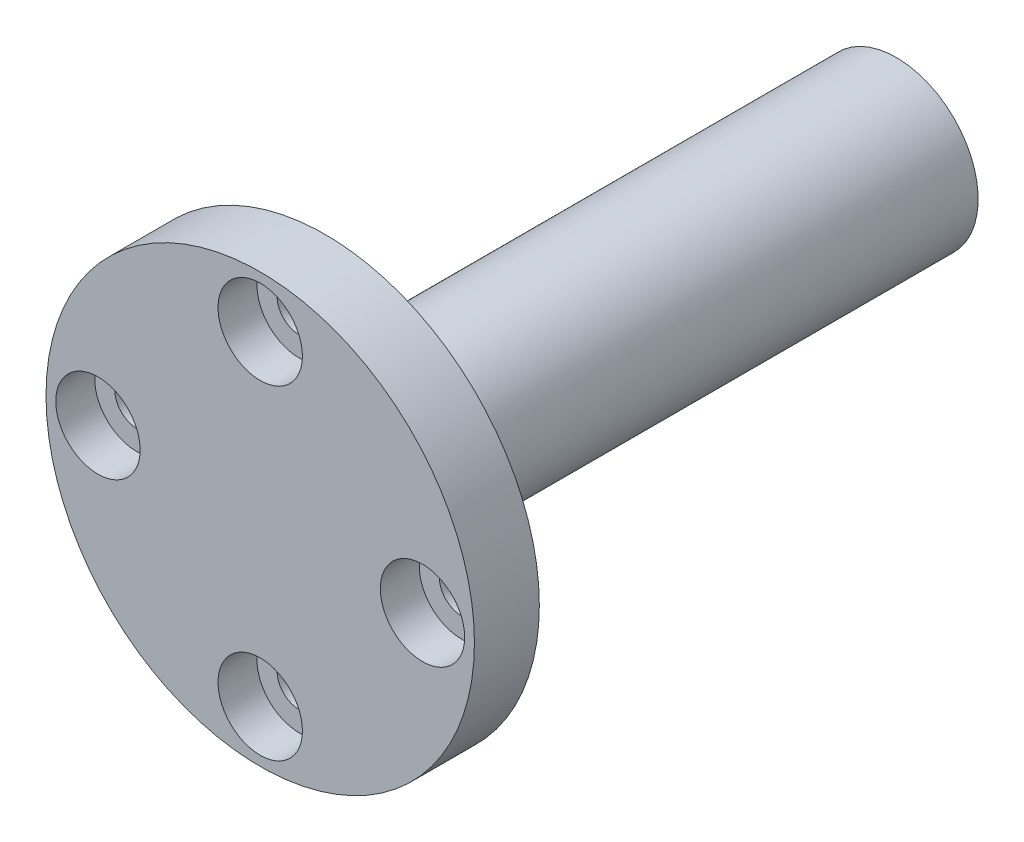
ISO-10303-21;
HEADER;
FILE_DESCRIPTION(('STEP AP214'),'2;1');
FILE_NAME('part.step','',(''),(''),'','','');
FILE_SCHEMA(('AUTOMOTIVE_DESIGN { 1 0 10303 214 1 1 1 1 }'));
ENDSEC;
DATA;
#1=APPLICATION_CONTEXT('core data for automotive mechanical design processes');
#2=APPLICATION_PROTOCOL_DEFINITION('international standard','automotive_design',2000,#1);
#3=PRODUCT_CONTEXT('',#1,'mechanical');
#4=PRODUCT('Part','Part','',(#3));
#5=PRODUCT_RELATED_PRODUCT_CATEGORY('part','',(#4));
#6=PRODUCT_DEFINITION_FORMATION('','',#4);
#7=PRODUCT_DEFINITION_CONTEXT('part definition',#1,'design');
#8=PRODUCT_DEFINITION('design','',#6,#7);
#9=PRODUCT_DEFINITION_SHAPE('','',#8);
#10=(LENGTH_UNIT() NAMED_UNIT(*) SI_UNIT(.MILLI.,.METRE.));
#11=(NAMED_UNIT(*) PLANE_ANGLE_UNIT() SI_UNIT($,.RADIAN.));
#12=(NAMED_UNIT(*) SI_UNIT($,.STERADIAN.) SOLID_ANGLE_UNIT());
#13=UNCERTAINTY_MEASURE_WITH_UNIT(LENGTH_MEASURE(1.E-05),#10,'distance_accuracy_value','');
#14=(GEOMETRIC_REPRESENTATION_CONTEXT(3) GLOBAL_UNCERTAINTY_ASSIGNED_CONTEXT((#13)) GLOBAL_UNIT_ASSIGNED_CONTEXT((#10,
#11,#12)) REPRESENTATION_CONTEXT('',''));
#15=CARTESIAN_POINT('',(0.,0.,0.));
#16=DIRECTION('',(0.,0.,1.));
#17=DIRECTION('',(1.,0.,0.));
#18=AXIS2_PLACEMENT_3D('',#15,#16,#17);
#19=CARTESIAN_POINT('',(0.,0.,0.));
#20=DIRECTION('',(0.,0.,1.));
#21=DIRECTION('',(1.,0.,0.));
#22=AXIS2_PLACEMENT_3D('',#19,#20,#21);
#23=PLANE('',#22);
#24=CARTESIAN_POINT('',(-12.4999999999996,-3.52209826717166E-13,0.));
#25=DIRECTION('',(0.,0.,1.));
#26=DIRECTION('',(1.,0.,0.));
#27=AXIS2_PLACEMENT_3D('',#24,#25,#26);
#28=CIRCLE('',#27,3.25);
#29=CARTESIAN_POINT('',(-9.24999999999965,-3.52209826717166E-13,0.));
#30=VERTEX_POINT('',#29);
#31=EDGE_CURVE('E115',#30,#30,#28,.T.);
#32=ORIENTED_EDGE('',*,*,#31,.F.);
#33=EDGE_LOOP('',(#32));
#34=FACE_BOUND('',#33,.T.);
#35=CARTESIAN_POINT('',(0.,12.5,0.));
#36=DIRECTION('',(0.,0.,1.));
#37=DIRECTION('',(1.,0.,0.));
#38=AXIS2_PLACEMENT_3D('',#35,#36,#37);
#39=CIRCLE('',#38,3.25);
#40=CARTESIAN_POINT('',(3.25,12.5,0.));
#41=VERTEX_POINT('',#40);
#42=EDGE_CURVE('E73',#41,#41,#39,.T.);
#43=ORIENTED_EDGE('',*,*,#42,.F.);
#44=EDGE_LOOP('',(#43));
#45=FACE_BOUND('',#44,.T.);
#46=CARTESIAN_POINT('',(12.5000000000004,3.537406352161E-13,0.));
#47=DIRECTION('',(0.,0.,1.));
#48=DIRECTION('',(1.,0.,0.));
#49=AXIS2_PLACEMENT_3D('',#46,#47,#48);
#50=CIRCLE('',#49,3.25);
#51=CARTESIAN_POINT('',(15.7500000000004,3.537406352161E-13,0.));
#52=VERTEX_POINT('',#51);
#53=EDGE_CURVE('E60',#52,#52,#50,.T.);
#54=ORIENTED_EDGE('',*,*,#53,.F.);
#55=EDGE_LOOP('',(#54));
#56=FACE_BOUND('',#55,.T.);
#57=CARTESIAN_POINT('',(7.074812704322E-13,-12.5,0.));
#58=DIRECTION('',(0.,0.,1.));
#59=DIRECTION('',(1.,0.,0.));
#60=AXIS2_PLACEMENT_3D('',#57,#58,#59);
#61=CIRCLE('',#60,3.25);
#62=CARTESIAN_POINT('',(3.25000000000071,-12.5,0.));
#63=VERTEX_POINT('',#62);
#64=EDGE_CURVE('E56',#63,#63,#61,.T.);
#65=ORIENTED_EDGE('',*,*,#64,.F.);
#66=EDGE_LOOP('',(#65));
#67=FACE_BOUND('',#66,.T.);
#68=CARTESIAN_POINT('',(0.,0.,0.));
#69=DIRECTION('',(0.,0.,-1.));
#70=DIRECTION('',(-1.,0.,0.));
#71=AXIS2_PLACEMENT_3D('',#68,#69,#70);
#72=CIRCLE('',#71,16.5);
#73=CARTESIAN_POINT('',(-16.5,0.,0.));
#74=VERTEX_POINT('',#73);
#75=EDGE_CURVE('E10',#74,#74,#72,.T.);
#76=ORIENTED_EDGE('',*,*,#75,.F.);
#77=EDGE_LOOP('',(#76));
#78=FACE_BOUND('',#77,.T.);
#79=ADVANCED_FACE('F33',(#34,#45,#56,#67,#78),#23,.T.);
#80=CARTESIAN_POINT('',(0.,0.,-49.));
#81=DIRECTION('',(0.,0.,-1.));
#82=DIRECTION('',(-1.,0.,0.));
#83=AXIS2_PLACEMENT_3D('',#80,#81,#82);
#84=CYLINDRICAL_SURFACE('',#83,16.5);
#85=ORIENTED_EDGE('',*,*,#75,.T.);
#86=EDGE_LOOP('',(#85));
#87=FACE_BOUND('',#86,.T.);
#88=CARTESIAN_POINT('',(0.,0.,-5.));
#89=DIRECTION('',(0.,0.,-1.));
#90=DIRECTION('',(-1.,0.,0.));
#91=AXIS2_PLACEMENT_3D('',#88,#89,#90);
#92=CIRCLE('',#91,16.5);
#93=CARTESIAN_POINT('',(-16.5,0.,-5.));
#94=VERTEX_POINT('',#93);
#95=EDGE_CURVE('E40',#94,#94,#92,.T.);
#96=ORIENTED_EDGE('',*,*,#95,.F.);
#97=EDGE_LOOP('',(#96));
#98=FACE_BOUND('',#97,.T.);
#99=ADVANCED_FACE('F97',(#87,#98),#84,.T.);
#100=CARTESIAN_POINT('',(0.,16.5,-5.));
#101=DIRECTION('',(0.,0.,-1.));
#102=DIRECTION('',(-1.,0.,0.));
#103=AXIS2_PLACEMENT_3D('',#100,#101,#102);
#104=PLANE('',#103);
#105=CARTESIAN_POINT('',(-12.4999999999996,-3.52209826717166E-13,-5.));
#106=DIRECTION('',(0.,0.,-1.));
#107=DIRECTION('',(-1.,0.,0.));
#108=AXIS2_PLACEMENT_3D('',#105,#106,#107);
#109=CIRCLE('',#108,1.69999999999999);
#110=CARTESIAN_POINT('',(-14.1999999999996,-3.52209826717166E-13,-5.));
#111=VERTEX_POINT('',#110);
#112=EDGE_CURVE('E36',#111,#111,#109,.T.);
#113=ORIENTED_EDGE('',*,*,#112,.F.);
#114=EDGE_LOOP('',(#113));
#115=FACE_BOUND('',#114,.T.);
#116=CARTESIAN_POINT('',(0.,12.5,-5.));
#117=DIRECTION('',(0.,0.,-1.));
#118=DIRECTION('',(-1.,0.,0.));
#119=AXIS2_PLACEMENT_3D('',#116,#117,#118);
#120=CIRCLE('',#119,1.69999999999999);
#121=CARTESIAN_POINT('',(-1.69999999999999,12.5,-5.));
#122=VERTEX_POINT('',#121);
#123=EDGE_CURVE('E58',#122,#122,#120,.T.);
#124=ORIENTED_EDGE('',*,*,#123,.F.);
#125=EDGE_LOOP('',(#124));
#126=FACE_BOUND('',#125,.T.);
#127=CARTESIAN_POINT('',(12.5000000000004,3.537406352161E-13,-5.));
#128=DIRECTION('',(0.,0.,-1.));
#129=DIRECTION('',(-1.,0.,0.));
#130=AXIS2_PLACEMENT_3D('',#127,#128,#129);
#131=CIRCLE('',#130,1.69999999999999);
#132=CARTESIAN_POINT('',(10.8000000000004,3.537406352161E-13,-5.));
#133=VERTEX_POINT('',#132);
#134=EDGE_CURVE('E54',#133,#133,#131,.T.);
#135=ORIENTED_EDGE('',*,*,#134,.F.);
#136=EDGE_LOOP('',(#135));
#137=FACE_BOUND('',#136,.T.);
#138=CARTESIAN_POINT('',(7.074812704322E-13,-12.5,-5.));
#139=DIRECTION('',(0.,0.,-1.));
#140=DIRECTION('',(-1.,0.,0.));
#141=AXIS2_PLACEMENT_3D('',#138,#139,#140);
#142=CIRCLE('',#141,1.69999999999999);
#143=CARTESIAN_POINT('',(-1.69999999999929,-12.5,-5.));
#144=VERTEX_POINT('',#143);
#145=EDGE_CURVE('E49',#144,#144,#142,.T.);
#146=ORIENTED_EDGE('',*,*,#145,.F.);
#147=EDGE_LOOP('',(#146));
#148=FACE_BOUND('',#147,.T.);
#149=ORIENTED_EDGE('',*,*,#95,.T.);
#150=EDGE_LOOP('',(#149));
#151=FACE_BOUND('',#150,.T.);
#152=CARTESIAN_POINT('',(0.,0.,-5.));
#153=DIRECTION('',(0.,0.,-1.));
#154=DIRECTION('',(-1.,0.,0.));
#155=AXIS2_PLACEMENT_3D('',#152,#153,#154);
#156=CIRCLE('',#155,6.3);
#157=CARTESIAN_POINT('',(-6.3,0.,-5.));
#158=VERTEX_POINT('',#157);
#159=EDGE_CURVE('E45',#158,#158,#156,.T.);
#160=ORIENTED_EDGE('',*,*,#159,.F.);
#161=EDGE_LOOP('',(#160));
#162=FACE_BOUND('',#161,.T.);
#163=ADVANCED_FACE('F95',(#115,#126,#137,#148,#151,#162),#104,.T.);
#164=CARTESIAN_POINT('',(0.,0.,-49.));
#165=DIRECTION('',(0.,0.,-1.));
#166=DIRECTION('',(-1.,0.,0.));
#167=AXIS2_PLACEMENT_3D('',#164,#165,#166);
#168=CYLINDRICAL_SURFACE('',#167,6.3);
#169=ORIENTED_EDGE('',*,*,#159,.T.);
#170=EDGE_LOOP('',(#169));
#171=FACE_BOUND('',#170,.T.);
#172=CARTESIAN_POINT('',(0.,0.,-49.));
#173=DIRECTION('',(0.,0.,-1.));
#174=DIRECTION('',(-1.,0.,0.));
#175=AXIS2_PLACEMENT_3D('',#172,#173,#174);
#176=CIRCLE('',#175,6.3);
#177=CARTESIAN_POINT('',(-6.3,0.,-49.));
#178=VERTEX_POINT('',#177);
#179=EDGE_CURVE('E52',#178,#178,#176,.T.);
#180=ORIENTED_EDGE('',*,*,#179,.F.);
#181=EDGE_LOOP('',(#180));
#182=FACE_BOUND('',#181,.T.);
#183=ADVANCED_FACE('F92',(#171,#182),#168,.T.);
#184=CARTESIAN_POINT('',(0.,6.3,-49.));
#185=DIRECTION('',(0.,0.,-1.));
#186=DIRECTION('',(-1.,0.,0.));
#187=AXIS2_PLACEMENT_3D('',#184,#185,#186);
#188=PLANE('',#187);
#189=ORIENTED_EDGE('',*,*,#179,.T.);
#190=EDGE_LOOP('',(#189));
#191=FACE_BOUND('',#190,.T.);
#192=ADVANCED_FACE('F104',(#191),#188,.T.);
#193=CARTESIAN_POINT('',(7.074812704322E-13,-12.5,0.));
#194=DIRECTION('',(0.,0.,1.));
#195=DIRECTION('',(1.,0.,0.));
#196=AXIS2_PLACEMENT_3D('',#193,#194,#195);
#197=CYLINDRICAL_SURFACE('',#196,1.69999999999999);
#198=ORIENTED_EDGE('',*,*,#145,.T.);
#199=EDGE_LOOP('',(#198));
#200=FACE_BOUND('',#199,.T.);
#201=CARTESIAN_POINT('',(7.074812704322E-13,-12.5,-3.));
#202=DIRECTION('',(0.,0.,1.));
#203=DIRECTION('',(1.,0.,0.));
#204=AXIS2_PLACEMENT_3D('',#201,#202,#203);
#205=CIRCLE('',#204,1.7);
#206=CARTESIAN_POINT('',(1.70000000000071,-12.5,-3.));
#207=VERTEX_POINT('',#206);
#208=EDGE_CURVE('E53',#207,#207,#205,.T.);
#209=ORIENTED_EDGE('',*,*,#208,.T.);
#210=EDGE_LOOP('',(#209));
#211=FACE_BOUND('',#210,.T.);
#212=ADVANCED_FACE('F137',(#200,#211),#197,.F.);
#213=CARTESIAN_POINT('',(1.70000000000071,-12.5,-3.));
#214=DIRECTION('',(0.,0.,-1.));
#215=DIRECTION('',(-1.,0.,0.));
#216=AXIS2_PLACEMENT_3D('',#213,#214,#215);
#217=PLANE('',#216);
#218=ORIENTED_EDGE('',*,*,#208,.F.);
#219=EDGE_LOOP('',(#218));
#220=FACE_BOUND('',#219,.T.);
#221=CARTESIAN_POINT('',(7.074812704322E-13,-12.5,-3.));
#222=DIRECTION('',(0.,0.,1.));
#223=DIRECTION('',(1.,0.,0.));
#224=AXIS2_PLACEMENT_3D('',#221,#222,#223);
#225=CIRCLE('',#224,3.25);
#226=CARTESIAN_POINT('',(3.25000000000071,-12.5,-3.));
#227=VERTEX_POINT('',#226);
#228=EDGE_CURVE('E83',#227,#227,#225,.T.);
#229=ORIENTED_EDGE('',*,*,#228,.T.);
#230=EDGE_LOOP('',(#229));
#231=FACE_BOUND('',#230,.T.);
#232=ADVANCED_FACE('F127',(#220,#231),#217,.F.);
#233=CARTESIAN_POINT('',(7.074812704322E-13,-12.5,0.));
#234=DIRECTION('',(0.,0.,1.));
#235=DIRECTION('',(1.,0.,0.));
#236=AXIS2_PLACEMENT_3D('',#233,#234,#235);
#237=CYLINDRICAL_SURFACE('',#236,3.25);
#238=ORIENTED_EDGE('',*,*,#228,.F.);
#239=EDGE_LOOP('',(#238));
#240=FACE_BOUND('',#239,.T.);
#241=ORIENTED_EDGE('',*,*,#64,.T.);
#242=EDGE_LOOP('',(#241));
#243=FACE_BOUND('',#242,.T.);
#244=ADVANCED_FACE('F124',(#240,#243),#237,.F.);
#245=CARTESIAN_POINT('',(12.5000000000004,3.537406352161E-13,0.));
#246=DIRECTION('',(0.,0.,1.));
#247=DIRECTION('',(1.,0.,0.));
#248=AXIS2_PLACEMENT_3D('',#245,#246,#247);
#249=CYLINDRICAL_SURFACE('',#248,1.69999999999999);
#250=ORIENTED_EDGE('',*,*,#134,.T.);
#251=EDGE_LOOP('',(#250));
#252=FACE_BOUND('',#251,.T.);
#253=CARTESIAN_POINT('',(12.5000000000004,3.537406352161E-13,-3.));
#254=DIRECTION('',(0.,0.,1.));
#255=DIRECTION('',(1.,0.,0.));
#256=AXIS2_PLACEMENT_3D('',#253,#254,#255);
#257=CIRCLE('',#256,1.7);
#258=CARTESIAN_POINT('',(14.2000000000004,3.537406352161E-13,-3.));
#259=VERTEX_POINT('',#258);
#260=EDGE_CURVE('E57',#259,#259,#257,.T.);
#261=ORIENTED_EDGE('',*,*,#260,.T.);
#262=EDGE_LOOP('',(#261));
#263=FACE_BOUND('',#262,.T.);
#264=ADVANCED_FACE('F126',(#252,#263),#249,.F.);
#265=CARTESIAN_POINT('',(14.2000000000004,3.537406352161E-13,-3.));
#266=DIRECTION('',(0.,0.,-1.));
#267=DIRECTION('',(-1.,0.,0.));
#268=AXIS2_PLACEMENT_3D('',#265,#266,#267);
#269=PLANE('',#268);
#270=ORIENTED_EDGE('',*,*,#260,.F.);
#271=EDGE_LOOP('',(#270));
#272=FACE_BOUND('',#271,.T.);
#273=CARTESIAN_POINT('',(12.5000000000004,3.537406352161E-13,-3.));
#274=DIRECTION('',(0.,0.,1.));
#275=DIRECTION('',(1.,0.,0.));
#276=AXIS2_PLACEMENT_3D('',#273,#274,#275);
#277=CIRCLE('',#276,3.25);
#278=CARTESIAN_POINT('',(15.7500000000004,3.537406352161E-13,-3.));
#279=VERTEX_POINT('',#278);
#280=EDGE_CURVE('E65',#279,#279,#277,.T.);
#281=ORIENTED_EDGE('',*,*,#280,.T.);
#282=EDGE_LOOP('',(#281));
#283=FACE_BOUND('',#282,.T.);
#284=ADVANCED_FACE('F134',(#272,#283),#269,.F.);
#285=CARTESIAN_POINT('',(12.5000000000004,3.537406352161E-13,0.));
#286=DIRECTION('',(0.,0.,1.));
#287=DIRECTION('',(1.,0.,0.));
#288=AXIS2_PLACEMENT_3D('',#285,#286,#287);
#289=CYLINDRICAL_SURFACE('',#288,3.25);
#290=ORIENTED_EDGE('',*,*,#280,.F.);
#291=EDGE_LOOP('',(#290));
#292=FACE_BOUND('',#291,.T.);
#293=ORIENTED_EDGE('',*,*,#53,.T.);
#294=EDGE_LOOP('',(#293));
#295=FACE_BOUND('',#294,.T.);
#296=ADVANCED_FACE('F180',(#292,#295),#289,.F.);
#297=CARTESIAN_POINT('',(0.,12.5,0.));
#298=DIRECTION('',(0.,0.,1.));
#299=DIRECTION('',(1.,0.,0.));
#300=AXIS2_PLACEMENT_3D('',#297,#298,#299);
#301=CYLINDRICAL_SURFACE('',#300,1.69999999999999);
#302=ORIENTED_EDGE('',*,*,#123,.T.);
#303=EDGE_LOOP('',(#302));
#304=FACE_BOUND('',#303,.T.);
#305=CARTESIAN_POINT('',(0.,12.5,-3.));
#306=DIRECTION('',(0.,0.,1.));
#307=DIRECTION('',(1.,0.,0.));
#308=AXIS2_PLACEMENT_3D('',#305,#306,#307);
#309=CIRCLE('',#308,1.7);
#310=CARTESIAN_POINT('',(1.7,12.5,-3.));
#311=VERTEX_POINT('',#310);
#312=EDGE_CURVE('E61',#311,#311,#309,.T.);
#313=ORIENTED_EDGE('',*,*,#312,.T.);
#314=EDGE_LOOP('',(#313));
#315=FACE_BOUND('',#314,.T.);
#316=ADVANCED_FACE('F189',(#304,#315),#301,.F.);
#317=CARTESIAN_POINT('',(1.7,12.5,-3.));
#318=DIRECTION('',(0.,0.,-1.));
#319=DIRECTION('',(-1.,0.,0.));
#320=AXIS2_PLACEMENT_3D('',#317,#318,#319);
#321=PLANE('',#320);
#322=ORIENTED_EDGE('',*,*,#312,.F.);
#323=EDGE_LOOP('',(#322));
#324=FACE_BOUND('',#323,.T.);
#325=CARTESIAN_POINT('',(0.,12.5,-3.));
#326=DIRECTION('',(0.,0.,1.));
#327=DIRECTION('',(1.,0.,0.));
#328=AXIS2_PLACEMENT_3D('',#325,#326,#327);
#329=CIRCLE('',#328,3.25);
#330=CARTESIAN_POINT('',(3.25,12.5,-3.));
#331=VERTEX_POINT('',#330);
#332=EDGE_CURVE('E68',#331,#331,#329,.T.);
#333=ORIENTED_EDGE('',*,*,#332,.T.);
#334=EDGE_LOOP('',(#333));
#335=FACE_BOUND('',#334,.T.);
#336=ADVANCED_FACE('F199',(#324,#335),#321,.F.);
#337=CARTESIAN_POINT('',(0.,12.5,0.));
#338=DIRECTION('',(0.,0.,1.));
#339=DIRECTION('',(1.,0.,0.));
#340=AXIS2_PLACEMENT_3D('',#337,#338,#339);
#341=CYLINDRICAL_SURFACE('',#340,3.25);
#342=ORIENTED_EDGE('',*,*,#332,.F.);
#343=EDGE_LOOP('',(#342));
#344=FACE_BOUND('',#343,.T.);
#345=ORIENTED_EDGE('',*,*,#42,.T.);
#346=EDGE_LOOP('',(#345));
#347=FACE_BOUND('',#346,.T.);
#348=ADVANCED_FACE('F208',(#344,#347),#341,.F.);
#349=CARTESIAN_POINT('',(-12.4999999999996,-3.52209826717166E-13,0.));
#350=DIRECTION('',(0.,0.,1.));
#351=DIRECTION('',(1.,0.,0.));
#352=AXIS2_PLACEMENT_3D('',#349,#350,#351);
#353=CYLINDRICAL_SURFACE('',#352,1.69999999999999);
#354=ORIENTED_EDGE('',*,*,#112,.T.);
#355=EDGE_LOOP('',(#354));
#356=FACE_BOUND('',#355,.T.);
#357=CARTESIAN_POINT('',(-12.4999999999996,-3.52209826717166E-13,-3.));
#358=DIRECTION('',(0.,0.,1.));
#359=DIRECTION('',(1.,0.,0.));
#360=AXIS2_PLACEMENT_3D('',#357,#358,#359);
#361=CIRCLE('',#360,1.7);
#362=CARTESIAN_POINT('',(-10.7999999999996,-3.52209826717166E-13,-3.));
#363=VERTEX_POINT('',#362);
#364=EDGE_CURVE('E257',#363,#363,#361,.T.);
#365=ORIENTED_EDGE('',*,*,#364,.T.);
#366=EDGE_LOOP('',(#365));
#367=FACE_BOUND('',#366,.T.);
#368=ADVANCED_FACE('F218',(#356,#367),#353,.F.);
#369=CARTESIAN_POINT('',(-10.7999999999996,-3.52209826717166E-13,-3.));
#370=DIRECTION('',(0.,0.,-1.));
#371=DIRECTION('',(-1.,0.,0.));
#372=AXIS2_PLACEMENT_3D('',#369,#370,#371);
#373=PLANE('',#372);
#374=ORIENTED_EDGE('',*,*,#364,.F.);
#375=EDGE_LOOP('',(#374));
#376=FACE_BOUND('',#375,.T.);
#377=CARTESIAN_POINT('',(-12.4999999999996,-3.52209826717166E-13,-3.));
#378=DIRECTION('',(0.,0.,1.));
#379=DIRECTION('',(1.,0.,0.));
#380=AXIS2_PLACEMENT_3D('',#377,#378,#379);
#381=CIRCLE('',#380,3.25);
#382=CARTESIAN_POINT('',(-9.24999999999965,-3.52209826717166E-13,-3.));
#383=VERTEX_POINT('',#382);
#384=EDGE_CURVE('E255',#383,#383,#381,.T.);
#385=ORIENTED_EDGE('',*,*,#384,.T.);
#386=EDGE_LOOP('',(#385));
#387=FACE_BOUND('',#386,.T.);
#388=ADVANCED_FACE('F228',(#376,#387),#373,.F.);
#389=CARTESIAN_POINT('',(-12.4999999999996,-3.52209826717166E-13,0.));
#390=DIRECTION('',(0.,0.,1.));
#391=DIRECTION('',(1.,0.,0.));
#392=AXIS2_PLACEMENT_3D('',#389,#390,#391);
#393=CYLINDRICAL_SURFACE('',#392,3.25);
#394=ORIENTED_EDGE('',*,*,#384,.F.);
#395=EDGE_LOOP('',(#394));
#396=FACE_BOUND('',#395,.T.);
#397=ORIENTED_EDGE('',*,*,#31,.T.);
#398=EDGE_LOOP('',(#397));
#399=FACE_BOUND('',#398,.T.);
#400=ADVANCED_FACE('F238',(#396,#399),#393,.F.);
#401=CLOSED_SHELL('',(#79,#99,#163,#183,#192,#212,#232,#244,#264,#284,#296,#316,#336,#348,#368,
#388,#400));
#402=MANIFOLD_SOLID_BREP('B2',#401);
#403=ADVANCED_BREP_SHAPE_REPRESENTATION('',(#18,#402),#14);
#404=SHAPE_DEFINITION_REPRESENTATION(#9,#403);
ENDSEC;
END-ISO-10303-21;
